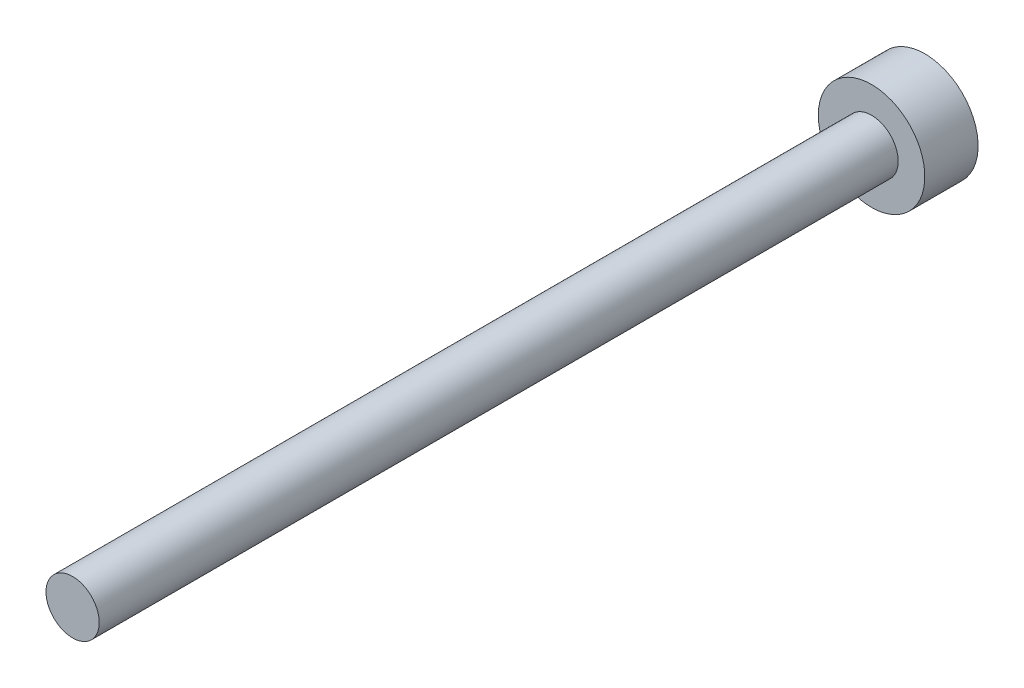
ISO-10303-21;
HEADER;
FILE_DESCRIPTION(('STEP AP214'),'2;1');
FILE_NAME('part.step','',(''),(''),'','','');
FILE_SCHEMA(('AUTOMOTIVE_DESIGN { 1 0 10303 214 1 1 1 1 }'));
ENDSEC;
DATA;
#1=APPLICATION_CONTEXT('core data for automotive mechanical design processes');
#2=APPLICATION_PROTOCOL_DEFINITION('international standard','automotive_design',2000,#1);
#3=PRODUCT_CONTEXT('',#1,'mechanical');
#4=PRODUCT('Part','Part','',(#3));
#5=PRODUCT_RELATED_PRODUCT_CATEGORY('part','',(#4));
#6=PRODUCT_DEFINITION_FORMATION('','',#4);
#7=PRODUCT_DEFINITION_CONTEXT('part definition',#1,'design');
#8=PRODUCT_DEFINITION('design','',#6,#7);
#9=PRODUCT_DEFINITION_SHAPE('','',#8);
#10=(LENGTH_UNIT() NAMED_UNIT(*) SI_UNIT(.MILLI.,.METRE.));
#11=(NAMED_UNIT(*) PLANE_ANGLE_UNIT() SI_UNIT($,.RADIAN.));
#12=(NAMED_UNIT(*) SI_UNIT($,.STERADIAN.) SOLID_ANGLE_UNIT());
#13=UNCERTAINTY_MEASURE_WITH_UNIT(LENGTH_MEASURE(1.E-05),#10,'distance_accuracy_value','');
#14=(GEOMETRIC_REPRESENTATION_CONTEXT(3) GLOBAL_UNCERTAINTY_ASSIGNED_CONTEXT((#13)) GLOBAL_UNIT_ASSIGNED_CONTEXT((#10,
#11,#12)) REPRESENTATION_CONTEXT('',''));
#15=CARTESIAN_POINT('',(0.,0.,0.));
#16=DIRECTION('',(0.,0.,1.));
#17=DIRECTION('',(1.,0.,0.));
#18=AXIS2_PLACEMENT_3D('',#15,#16,#17);
#19=CARTESIAN_POINT('',(0.,0.,45.));
#20=DIRECTION('',(0.,0.,-1.));
#21=DIRECTION('',(-1.,0.,0.));
#22=AXIS2_PLACEMENT_3D('',#19,#20,#21);
#23=CYLINDRICAL_SURFACE('',#22,1.5);
#24=CARTESIAN_POINT('',(0.,0.,45.));
#25=DIRECTION('',(0.,0.,1.));
#26=DIRECTION('',(1.,0.,0.));
#27=AXIS2_PLACEMENT_3D('',#24,#25,#26);
#28=CIRCLE('',#27,1.5);
#29=CARTESIAN_POINT('',(-1.5,0.,45.));
#30=VERTEX_POINT('',#29);
#31=EDGE_CURVE('E10',#30,#30,#28,.T.);
#32=CARTESIAN_POINT('',(0.,0.,0.));
#33=DIRECTION('',(0.,0.,-1.));
#34=DIRECTION('',(-1.,0.,0.));
#35=AXIS2_PLACEMENT_3D('',#32,#33,#34);
#36=CIRCLE('',#35,1.5);
#37=CARTESIAN_POINT('',(-1.5,0.,0.));
#38=VERTEX_POINT('',#37);
#39=EDGE_CURVE('E41',#38,#38,#36,.T.);
#40=CARTESIAN_POINT('',(-1.5,0.,45.));
#41=CARTESIAN_POINT('',(-1.5,0.,44.53125));
#42=CARTESIAN_POINT('',(-1.5,0.,44.0625));
#43=CARTESIAN_POINT('',(-1.5,0.,43.125));
#44=CARTESIAN_POINT('',(-1.5,0.,42.65625));
#45=CARTESIAN_POINT('',(-1.5,0.,41.71875));
#46=CARTESIAN_POINT('',(-1.5,0.,41.25));
#47=CARTESIAN_POINT('',(-1.5,0.,40.3125));
#48=CARTESIAN_POINT('',(-1.5,0.,39.84375));
#49=CARTESIAN_POINT('',(-1.5,0.,38.90625));
#50=CARTESIAN_POINT('',(-1.5,0.,38.4375));
#51=CARTESIAN_POINT('',(-1.5,0.,37.5));
#52=CARTESIAN_POINT('',(-1.5,0.,37.03125));
#53=CARTESIAN_POINT('',(-1.5,0.,36.09375));
#54=CARTESIAN_POINT('',(-1.5,0.,35.625));
#55=CARTESIAN_POINT('',(-1.5,0.,34.6875));
#56=CARTESIAN_POINT('',(-1.5,0.,34.21875));
#57=CARTESIAN_POINT('',(-1.5,0.,33.28125));
#58=CARTESIAN_POINT('',(-1.5,0.,32.8125));
#59=CARTESIAN_POINT('',(-1.5,0.,31.875));
#60=CARTESIAN_POINT('',(-1.5,0.,31.40625));
#61=CARTESIAN_POINT('',(-1.5,0.,30.46875));
#62=CARTESIAN_POINT('',(-1.5,0.,30.));
#63=CARTESIAN_POINT('',(-1.5,0.,29.0625));
#64=CARTESIAN_POINT('',(-1.5,0.,28.59375));
#65=CARTESIAN_POINT('',(-1.5,0.,27.65625));
#66=CARTESIAN_POINT('',(-1.5,0.,27.1875));
#67=CARTESIAN_POINT('',(-1.5,0.,26.25));
#68=CARTESIAN_POINT('',(-1.5,0.,25.78125));
#69=CARTESIAN_POINT('',(-1.5,0.,24.84375));
#70=CARTESIAN_POINT('',(-1.5,0.,24.375));
#71=CARTESIAN_POINT('',(-1.5,0.,23.4375));
#72=CARTESIAN_POINT('',(-1.5,0.,22.96875));
#73=CARTESIAN_POINT('',(-1.5,0.,22.03125));
#74=CARTESIAN_POINT('',(-1.5,0.,21.5625));
#75=CARTESIAN_POINT('',(-1.5,0.,20.625));
#76=CARTESIAN_POINT('',(-1.5,0.,20.15625));
#77=CARTESIAN_POINT('',(-1.5,0.,19.21875));
#78=CARTESIAN_POINT('',(-1.5,0.,18.75));
#79=CARTESIAN_POINT('',(-1.5,0.,17.8125));
#80=CARTESIAN_POINT('',(-1.5,0.,17.34375));
#81=CARTESIAN_POINT('',(-1.5,0.,16.40625));
#82=CARTESIAN_POINT('',(-1.5,0.,15.9375));
#83=CARTESIAN_POINT('',(-1.5,0.,15.));
#84=CARTESIAN_POINT('',(-1.5,0.,14.53125));
#85=CARTESIAN_POINT('',(-1.5,0.,13.59375));
#86=CARTESIAN_POINT('',(-1.5,0.,13.125));
#87=CARTESIAN_POINT('',(-1.5,0.,12.1875));
#88=CARTESIAN_POINT('',(-1.5,0.,11.71875));
#89=CARTESIAN_POINT('',(-1.5,0.,10.78125));
#90=CARTESIAN_POINT('',(-1.5,0.,10.3125));
#91=CARTESIAN_POINT('',(-1.5,0.,9.37500000000001));
#92=CARTESIAN_POINT('',(-1.5,0.,8.90625000000001));
#93=CARTESIAN_POINT('',(-1.5,0.,7.96875000000001));
#94=CARTESIAN_POINT('',(-1.5,0.,7.5));
#95=CARTESIAN_POINT('',(-1.5,0.,6.5625));
#96=CARTESIAN_POINT('',(-1.5,0.,6.09375));
#97=CARTESIAN_POINT('',(-1.5,0.,5.15625000000001));
#98=CARTESIAN_POINT('',(-1.5,0.,4.68750000000001));
#99=CARTESIAN_POINT('',(-1.5,0.,3.75000000000001));
#100=CARTESIAN_POINT('',(-1.5,0.,3.28125000000001));
#101=CARTESIAN_POINT('',(-1.5,0.,2.34375000000001));
#102=CARTESIAN_POINT('',(-1.5,0.,1.87500000000001));
#103=CARTESIAN_POINT('',(-1.5,0.,0.937500000000006));
#104=CARTESIAN_POINT('',(-1.5,0.,0.468750000000007));
#105=CARTESIAN_POINT('',(-1.5,0.,0.));
#106=B_SPLINE_CURVE_WITH_KNOTS('',3,(#40,#41,#42,#43,#44,#45,#46,#47,#48,#49,#50,#51,#52,#53,
#54,#55,#56,#57,#58,#59,#60,#61,#62,#63,#64,#65,#66,#67,#68,#69,#70,#71,#72,#73,#74,#75,#76,#77,
#78,#79,#80,#81,#82,#83,#84,#85,#86,#87,#88,#89,#90,#91,#92,#93,#94,#95,#96,#97,#98,#99,#100,
#101,#102,#103,#104,#105),.UNSPECIFIED.,.F.,.F.,(4,2,2,2,2,2,2,2,2,2,2,2,2,2,2,2,2,2,2,2,2,2,2,
2,2,2,2,2,2,2,2,2,4),(0.,1.40625,2.8125,4.21874999999999,5.625,7.03125,8.43749999999999,
9.84374999999999,11.25,12.65625,14.0625,15.46875,16.875,18.28125,19.6875,21.09375,22.5,23.90625,
25.3125,26.71875,28.125,29.53125,30.9375,32.34375,33.75,35.15625,36.5625,37.96875,39.375,
40.78125,42.1875,43.59375,45.),.UNSPECIFIED.);
#107=EDGE_CURVE('BSEAM35',#30,#38,#106,.T.);
#108=ORIENTED_EDGE('',*,*,#31,.F.);
#109=ORIENTED_EDGE('',*,*,#39,.F.);
#110=ORIENTED_EDGE('',*,*,#107,.T.);
#111=ORIENTED_EDGE('',*,*,#107,.F.);
#112=EDGE_LOOP('',(#108,#110,#109,#111));
#113=FACE_BOUND('',#112,.T.);
#114=ADVANCED_FACE('F35',(#113),#23,.T.);
#115=CARTESIAN_POINT('',(0.,0.,45.));
#116=DIRECTION('',(0.,0.,1.));
#117=DIRECTION('',(1.,0.,0.));
#118=AXIS2_PLACEMENT_3D('',#115,#116,#117);
#119=PLANE('',#118);
#120=ORIENTED_EDGE('',*,*,#31,.T.);
#121=EDGE_LOOP('',(#120));
#122=FACE_BOUND('',#121,.T.);
#123=ADVANCED_FACE('F68',(#122),#119,.T.);
#124=CARTESIAN_POINT('',(0.,0.,-3.));
#125=DIRECTION('',(0.,0.,1.));
#126=DIRECTION('',(1.,0.,0.));
#127=AXIS2_PLACEMENT_3D('',#124,#125,#126);
#128=CYLINDRICAL_SURFACE('',#127,3.);
#129=CARTESIAN_POINT('',(0.,0.,-3.));
#130=DIRECTION('',(0.,0.,-1.));
#131=DIRECTION('',(-1.,0.,0.));
#132=AXIS2_PLACEMENT_3D('',#129,#130,#131);
#133=CIRCLE('',#132,3.);
#134=CARTESIAN_POINT('',(-3.,0.,-3.));
#135=VERTEX_POINT('',#134);
#136=EDGE_CURVE('E45',#135,#135,#133,.T.);
#137=ORIENTED_EDGE('',*,*,#136,.F.);
#138=EDGE_LOOP('',(#137));
#139=FACE_BOUND('',#138,.T.);
#140=CARTESIAN_POINT('',(0.,0.,0.));
#141=DIRECTION('',(0.,0.,-1.));
#142=DIRECTION('',(-1.,0.,0.));
#143=AXIS2_PLACEMENT_3D('',#140,#141,#142);
#144=CIRCLE('',#143,3.);
#145=CARTESIAN_POINT('',(-3.,0.,0.));
#146=VERTEX_POINT('',#145);
#147=EDGE_CURVE('E49',#146,#146,#144,.T.);
#148=ORIENTED_EDGE('',*,*,#147,.T.);
#149=EDGE_LOOP('',(#148));
#150=FACE_BOUND('',#149,.T.);
#151=ADVANCED_FACE('F55',(#139,#150),#128,.T.);
#152=CARTESIAN_POINT('',(0.,0.,-3.));
#153=DIRECTION('',(0.,0.,-1.));
#154=DIRECTION('',(-1.,0.,0.));
#155=AXIS2_PLACEMENT_3D('',#152,#153,#154);
#156=PLANE('',#155);
#157=ORIENTED_EDGE('',*,*,#136,.T.);
#158=EDGE_LOOP('',(#157));
#159=FACE_BOUND('',#158,.T.);
#160=ADVANCED_FACE('F59',(#159),#156,.T.);
#161=CARTESIAN_POINT('',(0.,0.,0.));
#162=DIRECTION('',(0.,0.,-1.));
#163=DIRECTION('',(-1.,0.,0.));
#164=AXIS2_PLACEMENT_3D('',#161,#162,#163);
#165=PLANE('',#164);
#166=ORIENTED_EDGE('',*,*,#39,.T.);
#167=EDGE_LOOP('',(#166));
#168=FACE_BOUND('',#167,.T.);
#169=ORIENTED_EDGE('',*,*,#147,.F.);
#170=EDGE_LOOP('',(#169));
#171=FACE_BOUND('',#170,.T.);
#172=ADVANCED_FACE('F57',(#168,#171),#165,.F.);
#173=CLOSED_SHELL('',(#114,#123,#151,#160,#172));
#174=MANIFOLD_SOLID_BREP('B2',#173);
#175=ADVANCED_BREP_SHAPE_REPRESENTATION('',(#18,#174),#14);
#176=SHAPE_DEFINITION_REPRESENTATION(#9,#175);
ENDSEC;
END-ISO-10303-21;
